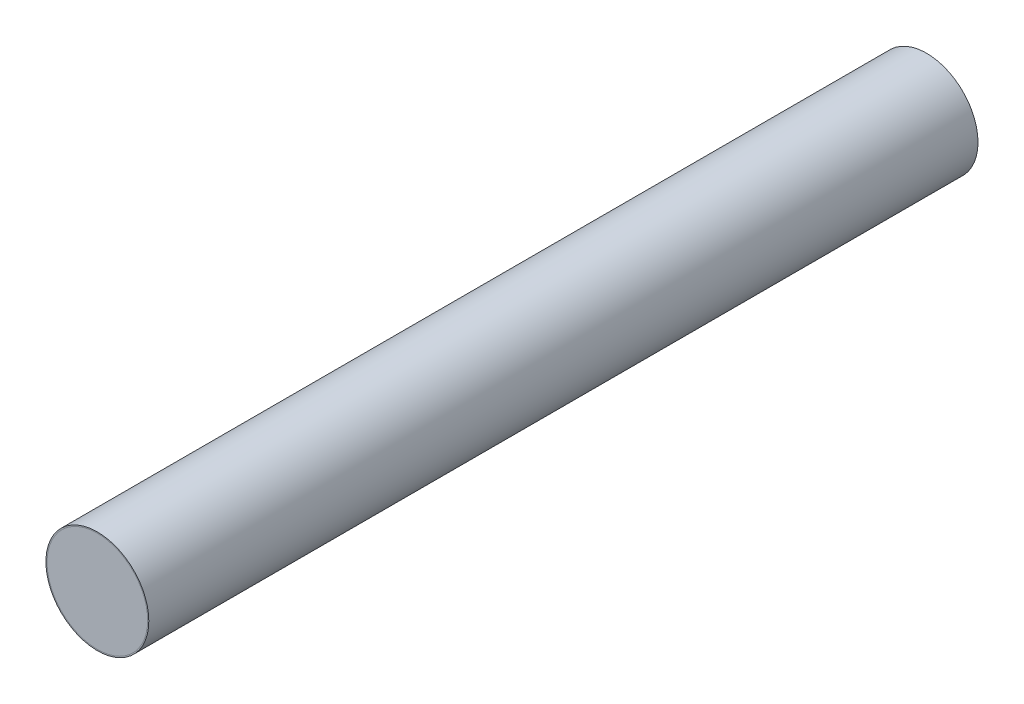
ISO-10303-21;
HEADER;
FILE_DESCRIPTION(('STEP AP214'),'2;1');
FILE_NAME('part.step','',(''),(''),'','','');
FILE_SCHEMA(('AUTOMOTIVE_DESIGN { 1 0 10303 214 1 1 1 1 }'));
ENDSEC;
DATA;
#1=APPLICATION_CONTEXT('core data for automotive mechanical design processes');
#2=APPLICATION_PROTOCOL_DEFINITION('international standard','automotive_design',2000,#1);
#3=PRODUCT_CONTEXT('',#1,'mechanical');
#4=PRODUCT('Part','Part','',(#3));
#5=PRODUCT_RELATED_PRODUCT_CATEGORY('part','',(#4));
#6=PRODUCT_DEFINITION_FORMATION('','',#4);
#7=PRODUCT_DEFINITION_CONTEXT('part definition',#1,'design');
#8=PRODUCT_DEFINITION('design','',#6,#7);
#9=PRODUCT_DEFINITION_SHAPE('','',#8);
#10=(LENGTH_UNIT() NAMED_UNIT(*) SI_UNIT(.MILLI.,.METRE.));
#11=(NAMED_UNIT(*) PLANE_ANGLE_UNIT() SI_UNIT($,.RADIAN.));
#12=(NAMED_UNIT(*) SI_UNIT($,.STERADIAN.) SOLID_ANGLE_UNIT());
#13=UNCERTAINTY_MEASURE_WITH_UNIT(LENGTH_MEASURE(1.E-05),#10,'distance_accuracy_value','');
#14=(GEOMETRIC_REPRESENTATION_CONTEXT(3) GLOBAL_UNCERTAINTY_ASSIGNED_CONTEXT((#13)) GLOBAL_UNIT_ASSIGNED_CONTEXT((#10,
#11,#12)) REPRESENTATION_CONTEXT('',''));
#15=CARTESIAN_POINT('',(0.,0.,0.));
#16=DIRECTION('',(0.,0.,1.));
#17=DIRECTION('',(1.,0.,0.));
#18=AXIS2_PLACEMENT_3D('',#15,#16,#17);
#19=CARTESIAN_POINT('',(0.,0.,312.463385192968));
#20=DIRECTION('',(0.,0.,-1.));
#21=DIRECTION('',(-1.,0.,0.));
#22=AXIS2_PLACEMENT_3D('',#19,#20,#21);
#23=CYLINDRICAL_SURFACE('',#22,16.1798);
#24=CARTESIAN_POINT('',(0.,0.,0.));
#25=DIRECTION('',(0.,0.,1.));
#26=DIRECTION('',(1.,0.,0.));
#27=AXIS2_PLACEMENT_3D('',#24,#25,#26);
#28=CIRCLE('',#27,16.1798);
#29=CARTESIAN_POINT('',(16.1798,0.,0.));
#30=VERTEX_POINT('',#29);
#31=EDGE_CURVE('E63',#30,#30,#28,.T.);
#32=ORIENTED_EDGE('',*,*,#31,.T.);
#33=EDGE_LOOP('',(#32));
#34=FACE_BOUND('',#33,.T.);
#35=CARTESIAN_POINT('',(0.,0.,266.7));
#36=DIRECTION('',(0.,0.,1.));
#37=DIRECTION('',(1.,0.,0.));
#38=AXIS2_PLACEMENT_3D('',#35,#36,#37);
#39=CIRCLE('',#38,16.1798);
#40=CARTESIAN_POINT('',(16.1798,0.,266.7));
#41=VERTEX_POINT('',#40);
#42=EDGE_CURVE('E11',#41,#41,#39,.T.);
#43=ORIENTED_EDGE('',*,*,#42,.F.);
#44=EDGE_LOOP('',(#43));
#45=FACE_BOUND('',#44,.T.);
#46=ADVANCED_FACE('F55',(#34,#45),#23,.T.);
#47=CARTESIAN_POINT('',(0.,0.,0.));
#48=DIRECTION('',(0.,0.,1.));
#49=DIRECTION('',(1.,0.,0.));
#50=AXIS2_PLACEMENT_3D('',#47,#48,#49);
#51=PLANE('',#50);
#52=ORIENTED_EDGE('',*,*,#31,.F.);
#53=EDGE_LOOP('',(#52));
#54=FACE_BOUND('',#53,.T.);
#55=ADVANCED_FACE('F72',(#54),#51,.F.);
#56=CARTESIAN_POINT('',(0.,0.,266.7));
#57=DIRECTION('',(0.,0.,1.));
#58=DIRECTION('',(1.,0.,0.));
#59=AXIS2_PLACEMENT_3D('',#56,#57,#58);
#60=PLANE('',#59);
#61=ORIENTED_EDGE('',*,*,#42,.T.);
#62=EDGE_LOOP('',(#61));
#63=FACE_BOUND('',#62,.T.);
#64=ADVANCED_FACE('F57',(#63),#60,.T.);
#65=CLOSED_SHELL('',(#46,#55,#64));
#66=MANIFOLD_SOLID_BREP('B2',#65);
#67=CARTESIAN_POINT('',(0.,0.,266.7));
#68=DIRECTION('',(0.,0.,1.));
#69=DIRECTION('',(1.,0.,0.));
#70=AXIS2_PLACEMENT_3D('',#67,#68,#69);
#71=PLANE('',#70);
#72=CARTESIAN_POINT('',(0.,0.,266.7));
#73=DIRECTION('',(0.,0.,1.));
#74=DIRECTION('',(1.,0.,0.));
#75=AXIS2_PLACEMENT_3D('',#72,#73,#74);
#76=CIRCLE('',#75,16.5481);
#77=CARTESIAN_POINT('',(16.5481,0.,266.7));
#78=VERTEX_POINT('',#77);
#79=EDGE_CURVE('E54',#78,#78,#76,.T.);
#80=ORIENTED_EDGE('',*,*,#79,.T.);
#81=EDGE_LOOP('',(#80));
#82=FACE_BOUND('',#81,.T.);
#83=CARTESIAN_POINT('',(0.,0.,266.7));
#84=DIRECTION('',(0.,0.,1.));
#85=DIRECTION('',(1.,0.,0.));
#86=AXIS2_PLACEMENT_3D('',#83,#84,#85);
#87=CIRCLE('',#86,16.1798);
#88=CARTESIAN_POINT('',(16.1798,0.,266.7));
#89=VERTEX_POINT('',#88);
#90=EDGE_CURVE('E121',#89,#89,#87,.T.);
#91=ORIENTED_EDGE('',*,*,#90,.F.);
#92=EDGE_LOOP('',(#91));
#93=FACE_BOUND('',#92,.T.);
#94=ADVANCED_FACE('F110',(#82,#93),#71,.T.);
#95=CARTESIAN_POINT('',(0.,0.,0.));
#96=DIRECTION('',(0.,0.,1.));
#97=DIRECTION('',(1.,0.,0.));
#98=AXIS2_PLACEMENT_3D('',#95,#96,#97);
#99=PLANE('',#98);
#100=CARTESIAN_POINT('',(0.,0.,0.));
#101=DIRECTION('',(0.,0.,1.));
#102=DIRECTION('',(1.,0.,0.));
#103=AXIS2_PLACEMENT_3D('',#100,#101,#102);
#104=CIRCLE('',#103,16.5481);
#105=CARTESIAN_POINT('',(16.5481,0.,0.));
#106=VERTEX_POINT('',#105);
#107=EDGE_CURVE('E114',#106,#106,#104,.T.);
#108=ORIENTED_EDGE('',*,*,#107,.F.);
#109=EDGE_LOOP('',(#108));
#110=FACE_BOUND('',#109,.T.);
#111=CARTESIAN_POINT('',(0.,0.,0.));
#112=DIRECTION('',(0.,0.,1.));
#113=DIRECTION('',(1.,0.,0.));
#114=AXIS2_PLACEMENT_3D('',#111,#112,#113);
#115=CIRCLE('',#114,16.1798);
#116=CARTESIAN_POINT('',(16.1798,0.,0.));
#117=VERTEX_POINT('',#116);
#118=EDGE_CURVE('E123',#117,#117,#115,.T.);
#119=ORIENTED_EDGE('',*,*,#118,.T.);
#120=EDGE_LOOP('',(#119));
#121=FACE_BOUND('',#120,.T.);
#122=ADVANCED_FACE('F133',(#110,#121),#99,.F.);
#123=CARTESIAN_POINT('',(0.,0.,266.7));
#124=DIRECTION('',(0.,0.,-1.));
#125=DIRECTION('',(-1.,0.,0.));
#126=AXIS2_PLACEMENT_3D('',#123,#124,#125);
#127=CYLINDRICAL_SURFACE('',#126,16.5481);
#128=ORIENTED_EDGE('',*,*,#79,.F.);
#129=EDGE_LOOP('',(#128));
#130=FACE_BOUND('',#129,.T.);
#131=ORIENTED_EDGE('',*,*,#107,.T.);
#132=EDGE_LOOP('',(#131));
#133=FACE_BOUND('',#132,.T.);
#134=ADVANCED_FACE('F112',(#130,#133),#127,.T.);
#135=CARTESIAN_POINT('',(0.,0.,266.7));
#136=DIRECTION('',(0.,0.,-1.));
#137=DIRECTION('',(-1.,0.,0.));
#138=AXIS2_PLACEMENT_3D('',#135,#136,#137);
#139=CYLINDRICAL_SURFACE('',#138,16.1798);
#140=ORIENTED_EDGE('',*,*,#90,.T.);
#141=EDGE_LOOP('',(#140));
#142=FACE_BOUND('',#141,.T.);
#143=ORIENTED_EDGE('',*,*,#118,.F.);
#144=EDGE_LOOP('',(#143));
#145=FACE_BOUND('',#144,.T.);
#146=ADVANCED_FACE('F129',(#142,#145),#139,.F.);
#147=CLOSED_SHELL('',(#94,#122,#134,#146));
#148=MANIFOLD_SOLID_BREP('B6',#147);
#149=ADVANCED_BREP_SHAPE_REPRESENTATION('',(#18,#66,#148),#14);
#150=SHAPE_DEFINITION_REPRESENTATION(#9,#149);
ENDSEC;
END-ISO-10303-21;
